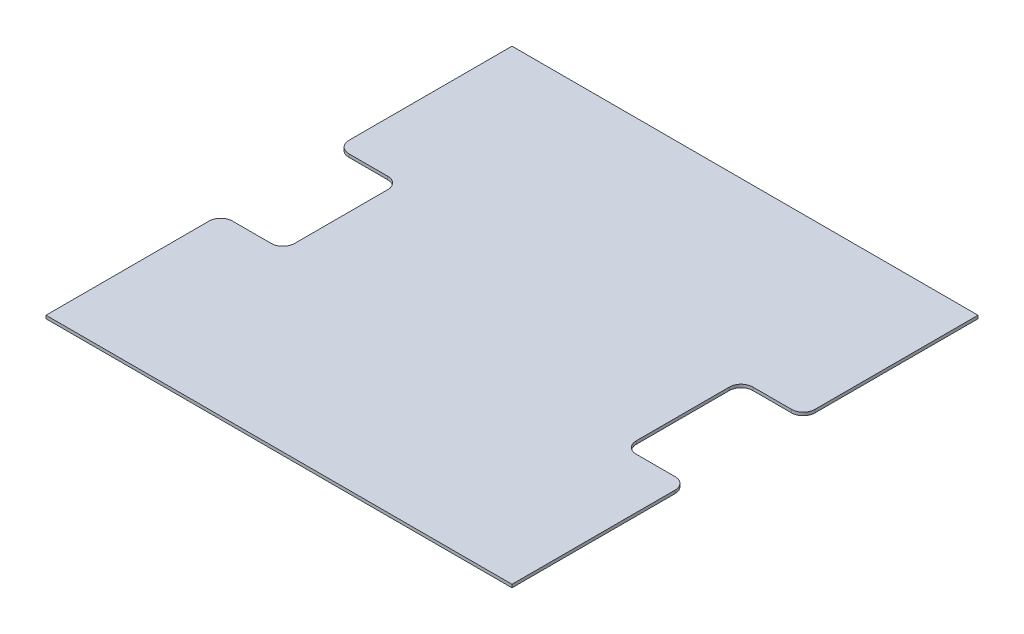
ISO-10303-21;
HEADER;
FILE_DESCRIPTION(('STEP AP214'),'2;1');
FILE_NAME('part.step','',(''),(''),'','','');
FILE_SCHEMA(('AUTOMOTIVE_DESIGN { 1 0 10303 214 1 1 1 1 }'));
ENDSEC;
DATA;
#1=APPLICATION_CONTEXT('core data for automotive mechanical design processes');
#2=APPLICATION_PROTOCOL_DEFINITION('international standard','automotive_design',2000,#1);
#3=PRODUCT_CONTEXT('',#1,'mechanical');
#4=PRODUCT('Part','Part','',(#3));
#5=PRODUCT_RELATED_PRODUCT_CATEGORY('part','',(#4));
#6=PRODUCT_DEFINITION_FORMATION('','',#4);
#7=PRODUCT_DEFINITION_CONTEXT('part definition',#1,'design');
#8=PRODUCT_DEFINITION('design','',#6,#7);
#9=PRODUCT_DEFINITION_SHAPE('','',#8);
#10=(LENGTH_UNIT() NAMED_UNIT(*) SI_UNIT(.MILLI.,.METRE.));
#11=(NAMED_UNIT(*) PLANE_ANGLE_UNIT() SI_UNIT($,.RADIAN.));
#12=(NAMED_UNIT(*) SI_UNIT($,.STERADIAN.) SOLID_ANGLE_UNIT());
#13=UNCERTAINTY_MEASURE_WITH_UNIT(LENGTH_MEASURE(1.E-05),#10,'distance_accuracy_value','');
#14=(GEOMETRIC_REPRESENTATION_CONTEXT(3) GLOBAL_UNCERTAINTY_ASSIGNED_CONTEXT((#13)) GLOBAL_UNIT_ASSIGNED_CONTEXT((#10,
#11,#12)) REPRESENTATION_CONTEXT('',''));
#15=CARTESIAN_POINT('',(0.,0.,0.));
#16=DIRECTION('',(0.,0.,1.));
#17=DIRECTION('',(1.,0.,0.));
#18=AXIS2_PLACEMENT_3D('',#15,#16,#17);
#19=CARTESIAN_POINT('',(-300.,4.,300.));
#20=DIRECTION('',(1.,0.,0.));
#21=DIRECTION('',(0.,0.,-1.));
#22=AXIS2_PLACEMENT_3D('',#19,#20,#21);
#23=PLANE('',#22);
#24=DIRECTION('',(0.,0.,1.));
#25=VECTOR('',#24,1.);
#26=CARTESIAN_POINT('',(-300.,0.,300.));
#27=LINE('',#26,#25);
#28=CARTESIAN_POINT('',(-300.,0.,-300.));
#29=VERTEX_POINT('',#28);
#30=CARTESIAN_POINT('',(-300.,0.,-90.));
#31=VERTEX_POINT('',#30);
#32=EDGE_CURVE('E318',#29,#31,#27,.T.);
#33=ORIENTED_EDGE('',*,*,#32,.T.);
#34=DIRECTION('',(0.,-1.,0.));
#35=VECTOR('',#34,1.);
#36=CARTESIAN_POINT('',(-300.,4.,-90.));
#37=LINE('',#36,#35);
#38=CARTESIAN_POINT('',(-300.,4.,-90.));
#39=VERTEX_POINT('',#38);
#40=EDGE_CURVE('E50',#31,#39,#37,.F.);
#41=ORIENTED_EDGE('',*,*,#40,.T.);
#42=DIRECTION('',(0.,0.,1.));
#43=VECTOR('',#42,1.);
#44=CARTESIAN_POINT('',(-300.,4.,300.));
#45=LINE('',#44,#43);
#46=CARTESIAN_POINT('',(-300.,4.,-300.));
#47=VERTEX_POINT('',#46);
#48=EDGE_CURVE('E307',#47,#39,#45,.T.);
#49=ORIENTED_EDGE('',*,*,#48,.F.);
#50=DIRECTION('',(0.,-1.,0.));
#51=VECTOR('',#50,1.);
#52=CARTESIAN_POINT('',(-300.,4.,-300.));
#53=LINE('',#52,#51);
#54=EDGE_CURVE('E189',#47,#29,#53,.T.);
#55=ORIENTED_EDGE('',*,*,#54,.T.);
#56=EDGE_LOOP('',(#33,#41,#49,#55));
#57=FACE_BOUND('',#56,.T.);
#58=ADVANCED_FACE('F35',(#57),#23,.F.);
#59=CARTESIAN_POINT('',(-300.,4.,90.));
#60=VERTEX_POINT('',#59);
#61=CARTESIAN_POINT('',(-300.,4.,300.));
#62=VERTEX_POINT('',#61);
#63=EDGE_CURVE('E190',#60,#62,#45,.T.);
#64=ORIENTED_EDGE('',*,*,#63,.F.);
#65=DIRECTION('',(0.,-1.,0.));
#66=VECTOR('',#65,1.);
#67=CARTESIAN_POINT('',(-300.,0.,90.));
#68=LINE('',#67,#66);
#69=CARTESIAN_POINT('',(-300.,0.,90.));
#70=VERTEX_POINT('',#69);
#71=EDGE_CURVE('E196',#60,#70,#68,.T.);
#72=ORIENTED_EDGE('',*,*,#71,.T.);
#73=CARTESIAN_POINT('',(-300.,0.,300.));
#74=VERTEX_POINT('',#73);
#75=EDGE_CURVE('E317',#70,#74,#27,.T.);
#76=ORIENTED_EDGE('',*,*,#75,.T.);
#77=DIRECTION('',(0.,-1.,0.));
#78=VECTOR('',#77,1.);
#79=CARTESIAN_POINT('',(-300.,4.,300.));
#80=LINE('',#79,#78);
#81=EDGE_CURVE('E201',#62,#74,#80,.T.);
#82=ORIENTED_EDGE('',*,*,#81,.F.);
#83=EDGE_LOOP('',(#64,#72,#76,#82));
#84=FACE_BOUND('',#83,.T.);
#85=ADVANCED_FACE('F341',(#84),#23,.F.);
#86=CARTESIAN_POINT('',(0.,4.,0.));
#87=DIRECTION('',(0.,-1.,0.));
#88=DIRECTION('',(0.,0.,-1.));
#89=AXIS2_PLACEMENT_3D('',#86,#87,#88);
#90=PLANE('',#89);
#91=DIRECTION('',(-1.,0.,0.));
#92=VECTOR('',#91,1.);
#93=CARTESIAN_POINT('',(-300.,4.,75.));
#94=LINE('',#93,#92);
#95=CARTESIAN_POINT('',(-235.,4.,75.));
#96=VERTEX_POINT('',#95);
#97=CARTESIAN_POINT('',(-285.,4.,75.));
#98=VERTEX_POINT('',#97);
#99=EDGE_CURVE('E282',#96,#98,#94,.T.);
#100=ORIENTED_EDGE('',*,*,#99,.T.);
#101=CARTESIAN_POINT('',(-285.,4.,90.));
#102=DIRECTION('',(0.,-1.,0.));
#103=DIRECTION('',(0.,0.,-1.));
#104=AXIS2_PLACEMENT_3D('',#101,#102,#103);
#105=CIRCLE('',#104,15.);
#106=EDGE_CURVE('E222',#98,#60,#105,.F.);
#107=ORIENTED_EDGE('',*,*,#106,.T.);
#108=ORIENTED_EDGE('',*,*,#63,.T.);
#109=DIRECTION('',(1.,0.,0.));
#110=VECTOR('',#109,1.);
#111=CARTESIAN_POINT('',(-300.,4.,300.));
#112=LINE('',#111,#110);
#113=CARTESIAN_POINT('',(300.,4.,300.));
#114=VERTEX_POINT('',#113);
#115=EDGE_CURVE('E309',#62,#114,#112,.T.);
#116=ORIENTED_EDGE('',*,*,#115,.T.);
#117=DIRECTION('',(0.,0.,-1.));
#118=VECTOR('',#117,1.);
#119=CARTESIAN_POINT('',(300.,4.,300.));
#120=LINE('',#119,#118);
#121=CARTESIAN_POINT('',(300.,4.,90.));
#122=VERTEX_POINT('',#121);
#123=EDGE_CURVE('E181',#114,#122,#120,.T.);
#124=ORIENTED_EDGE('',*,*,#123,.T.);
#125=CARTESIAN_POINT('',(285.,4.,90.));
#126=DIRECTION('',(0.,-1.,0.));
#127=DIRECTION('',(0.,0.,-1.));
#128=AXIS2_PLACEMENT_3D('',#125,#126,#127);
#129=CIRCLE('',#128,15.);
#130=CARTESIAN_POINT('',(285.,4.,75.));
#131=VERTEX_POINT('',#130);
#132=EDGE_CURVE('E217',#122,#131,#129,.F.);
#133=ORIENTED_EDGE('',*,*,#132,.T.);
#134=DIRECTION('',(1.,0.,0.));
#135=VECTOR('',#134,1.);
#136=CARTESIAN_POINT('',(300.,4.,75.));
#137=LINE('',#136,#135);
#138=CARTESIAN_POINT('',(235.,4.,75.));
#139=VERTEX_POINT('',#138);
#140=EDGE_CURVE('E289',#139,#131,#137,.T.);
#141=ORIENTED_EDGE('',*,*,#140,.F.);
#142=CARTESIAN_POINT('',(235.,4.,60.));
#143=DIRECTION('',(0.,-1.,0.));
#144=DIRECTION('',(0.,0.,-1.));
#145=AXIS2_PLACEMENT_3D('',#142,#143,#144);
#146=CIRCLE('',#145,15.);
#147=CARTESIAN_POINT('',(220.,4.,60.));
#148=VERTEX_POINT('',#147);
#149=EDGE_CURVE('E11',#139,#148,#146,.T.);
#150=ORIENTED_EDGE('',*,*,#149,.T.);
#151=DIRECTION('',(0.,0.,1.));
#152=VECTOR('',#151,1.);
#153=CARTESIAN_POINT('',(220.,4.,75.));
#154=LINE('',#153,#152);
#155=CARTESIAN_POINT('',(220.,4.,-60.));
#156=VERTEX_POINT('',#155);
#157=EDGE_CURVE('E287',#156,#148,#154,.T.);
#158=ORIENTED_EDGE('',*,*,#157,.F.);
#159=CARTESIAN_POINT('',(235.,4.,-60.));
#160=DIRECTION('',(0.,-1.,0.));
#161=DIRECTION('',(0.,0.,-1.));
#162=AXIS2_PLACEMENT_3D('',#159,#160,#161);
#163=CIRCLE('',#162,15.);
#164=CARTESIAN_POINT('',(235.,4.,-75.));
#165=VERTEX_POINT('',#164);
#166=EDGE_CURVE('E264',#156,#165,#163,.T.);
#167=ORIENTED_EDGE('',*,*,#166,.T.);
#168=DIRECTION('',(-1.,0.,0.));
#169=VECTOR('',#168,1.);
#170=CARTESIAN_POINT('',(300.,4.,-75.));
#171=LINE('',#170,#169);
#172=CARTESIAN_POINT('',(285.,4.,-75.));
#173=VERTEX_POINT('',#172);
#174=EDGE_CURVE('E293',#173,#165,#171,.T.);
#175=ORIENTED_EDGE('',*,*,#174,.F.);
#176=CARTESIAN_POINT('',(285.,4.,-90.));
#177=DIRECTION('',(0.,-1.,0.));
#178=DIRECTION('',(0.,0.,-1.));
#179=AXIS2_PLACEMENT_3D('',#176,#177,#178);
#180=CIRCLE('',#179,15.);
#181=CARTESIAN_POINT('',(300.,4.,-90.));
#182=VERTEX_POINT('',#181);
#183=EDGE_CURVE('E58',#173,#182,#180,.F.);
#184=ORIENTED_EDGE('',*,*,#183,.T.);
#185=CARTESIAN_POINT('',(300.,4.,-300.));
#186=VERTEX_POINT('',#185);
#187=EDGE_CURVE('E171',#182,#186,#120,.T.);
#188=ORIENTED_EDGE('',*,*,#187,.T.);
#189=DIRECTION('',(-1.,0.,0.));
#190=VECTOR('',#189,1.);
#191=CARTESIAN_POINT('',(-300.,4.,-300.));
#192=LINE('',#191,#190);
#193=EDGE_CURVE('E175',#186,#47,#192,.T.);
#194=ORIENTED_EDGE('',*,*,#193,.T.);
#195=ORIENTED_EDGE('',*,*,#48,.T.);
#196=CARTESIAN_POINT('',(-285.,4.,-90.));
#197=DIRECTION('',(0.,-1.,0.));
#198=DIRECTION('',(0.,0.,-1.));
#199=AXIS2_PLACEMENT_3D('',#196,#197,#198);
#200=CIRCLE('',#199,15.);
#201=CARTESIAN_POINT('',(-285.,4.,-75.));
#202=VERTEX_POINT('',#201);
#203=EDGE_CURVE('E220',#39,#202,#200,.F.);
#204=ORIENTED_EDGE('',*,*,#203,.T.);
#205=DIRECTION('',(1.,0.,0.));
#206=VECTOR('',#205,1.);
#207=CARTESIAN_POINT('',(-300.,4.,-75.));
#208=LINE('',#207,#206);
#209=CARTESIAN_POINT('',(-235.,4.,-75.));
#210=VERTEX_POINT('',#209);
#211=EDGE_CURVE('E301',#202,#210,#208,.T.);
#212=ORIENTED_EDGE('',*,*,#211,.T.);
#213=CARTESIAN_POINT('',(-235.,4.,-60.));
#214=DIRECTION('',(0.,-1.,0.));
#215=DIRECTION('',(0.,0.,-1.));
#216=AXIS2_PLACEMENT_3D('',#213,#214,#215);
#217=CIRCLE('',#216,15.);
#218=CARTESIAN_POINT('',(-220.,4.,-60.));
#219=VERTEX_POINT('',#218);
#220=EDGE_CURVE('E260',#210,#219,#217,.T.);
#221=ORIENTED_EDGE('',*,*,#220,.T.);
#222=DIRECTION('',(0.,0.,1.));
#223=VECTOR('',#222,1.);
#224=CARTESIAN_POINT('',(-220.,4.,75.));
#225=LINE('',#224,#223);
#226=CARTESIAN_POINT('',(-220.,4.,60.));
#227=VERTEX_POINT('',#226);
#228=EDGE_CURVE('E354',#219,#227,#225,.T.);
#229=ORIENTED_EDGE('',*,*,#228,.T.);
#230=CARTESIAN_POINT('',(-235.,4.,60.));
#231=DIRECTION('',(0.,-1.,0.));
#232=DIRECTION('',(0.,0.,-1.));
#233=AXIS2_PLACEMENT_3D('',#230,#231,#232);
#234=CIRCLE('',#233,15.);
#235=EDGE_CURVE('E256',#227,#96,#234,.T.);
#236=ORIENTED_EDGE('',*,*,#235,.T.);
#237=EDGE_LOOP('',(#100,#107,#108,#116,#124,#133,#141,#150,#158,#167,#175,#184,#188,#194,#195,
#204,#212,#221,#229,#236));
#238=FACE_BOUND('',#237,.T.);
#239=ADVANCED_FACE('F174',(#238),#90,.F.);
#240=CARTESIAN_POINT('',(0.,0.,0.));
#241=DIRECTION('',(0.,-1.,0.));
#242=DIRECTION('',(0.,0.,-1.));
#243=AXIS2_PLACEMENT_3D('',#240,#241,#242);
#244=PLANE('',#243);
#245=ORIENTED_EDGE('',*,*,#75,.F.);
#246=CARTESIAN_POINT('',(-285.,0.,90.));
#247=DIRECTION('',(0.,-1.,0.));
#248=DIRECTION('',(0.,0.,-1.));
#249=AXIS2_PLACEMENT_3D('',#246,#247,#248);
#250=CIRCLE('',#249,15.);
#251=CARTESIAN_POINT('',(-285.,0.,75.));
#252=VERTEX_POINT('',#251);
#253=EDGE_CURVE('E210',#70,#252,#250,.T.);
#254=ORIENTED_EDGE('',*,*,#253,.T.);
#255=DIRECTION('',(1.,0.,0.));
#256=VECTOR('',#255,1.);
#257=CARTESIAN_POINT('',(-300.,0.,75.));
#258=LINE('',#257,#256);
#259=CARTESIAN_POINT('',(-235.,0.,75.));
#260=VERTEX_POINT('',#259);
#261=EDGE_CURVE('E347',#252,#260,#258,.T.);
#262=ORIENTED_EDGE('',*,*,#261,.T.);
#263=CARTESIAN_POINT('',(-235.,0.,60.));
#264=DIRECTION('',(0.,-1.,0.));
#265=DIRECTION('',(0.,0.,-1.));
#266=AXIS2_PLACEMENT_3D('',#263,#264,#265);
#267=CIRCLE('',#266,15.);
#268=CARTESIAN_POINT('',(-220.,0.,60.));
#269=VERTEX_POINT('',#268);
#270=EDGE_CURVE('E254',#260,#269,#267,.F.);
#271=ORIENTED_EDGE('',*,*,#270,.T.);
#272=DIRECTION('',(0.,0.,-1.));
#273=VECTOR('',#272,1.);
#274=CARTESIAN_POINT('',(-220.,0.,75.));
#275=LINE('',#274,#273);
#276=CARTESIAN_POINT('',(-220.,0.,-60.));
#277=VERTEX_POINT('',#276);
#278=EDGE_CURVE('E352',#269,#277,#275,.T.);
#279=ORIENTED_EDGE('',*,*,#278,.T.);
#280=CARTESIAN_POINT('',(-235.,0.,-60.));
#281=DIRECTION('',(0.,-1.,0.));
#282=DIRECTION('',(0.,0.,-1.));
#283=AXIS2_PLACEMENT_3D('',#280,#281,#282);
#284=CIRCLE('',#283,15.);
#285=CARTESIAN_POINT('',(-235.,0.,-75.));
#286=VERTEX_POINT('',#285);
#287=EDGE_CURVE('E258',#277,#286,#284,.F.);
#288=ORIENTED_EDGE('',*,*,#287,.T.);
#289=DIRECTION('',(-1.,0.,0.));
#290=VECTOR('',#289,1.);
#291=CARTESIAN_POINT('',(-300.,0.,-75.));
#292=LINE('',#291,#290);
#293=CARTESIAN_POINT('',(-285.,0.,-75.));
#294=VERTEX_POINT('',#293);
#295=EDGE_CURVE('E356',#286,#294,#292,.T.);
#296=ORIENTED_EDGE('',*,*,#295,.T.);
#297=CARTESIAN_POINT('',(-285.,0.,-90.));
#298=DIRECTION('',(0.,-1.,0.));
#299=DIRECTION('',(0.,0.,-1.));
#300=AXIS2_PLACEMENT_3D('',#297,#298,#299);
#301=CIRCLE('',#300,15.);
#302=EDGE_CURVE('E208',#294,#31,#301,.T.);
#303=ORIENTED_EDGE('',*,*,#302,.T.);
#304=ORIENTED_EDGE('',*,*,#32,.F.);
#305=DIRECTION('',(-1.,0.,0.));
#306=VECTOR('',#305,1.);
#307=CARTESIAN_POINT('',(-300.,0.,-300.));
#308=LINE('',#307,#306);
#309=CARTESIAN_POINT('',(300.,0.,-300.));
#310=VERTEX_POINT('',#309);
#311=EDGE_CURVE('E315',#310,#29,#308,.T.);
#312=ORIENTED_EDGE('',*,*,#311,.F.);
#313=DIRECTION('',(0.,0.,-1.));
#314=VECTOR('',#313,1.);
#315=CARTESIAN_POINT('',(300.,0.,300.));
#316=LINE('',#315,#314);
#317=CARTESIAN_POINT('',(300.,0.,-90.));
#318=VERTEX_POINT('',#317);
#319=EDGE_CURVE('E194',#318,#310,#316,.T.);
#320=ORIENTED_EDGE('',*,*,#319,.F.);
#321=CARTESIAN_POINT('',(285.,0.,-90.));
#322=DIRECTION('',(0.,-1.,0.));
#323=DIRECTION('',(0.,0.,-1.));
#324=AXIS2_PLACEMENT_3D('',#321,#322,#323);
#325=CIRCLE('',#324,15.);
#326=CARTESIAN_POINT('',(285.,0.,-75.));
#327=VERTEX_POINT('',#326);
#328=EDGE_CURVE('E206',#318,#327,#325,.T.);
#329=ORIENTED_EDGE('',*,*,#328,.T.);
#330=DIRECTION('',(1.,0.,0.));
#331=VECTOR('',#330,1.);
#332=CARTESIAN_POINT('',(300.,0.,-75.));
#333=LINE('',#332,#331);
#334=CARTESIAN_POINT('',(235.,0.,-75.));
#335=VERTEX_POINT('',#334);
#336=EDGE_CURVE('E294',#335,#327,#333,.T.);
#337=ORIENTED_EDGE('',*,*,#336,.F.);
#338=CARTESIAN_POINT('',(235.,0.,-60.));
#339=DIRECTION('',(0.,-1.,0.));
#340=DIRECTION('',(0.,0.,-1.));
#341=AXIS2_PLACEMENT_3D('',#338,#339,#340);
#342=CIRCLE('',#341,15.);
#343=CARTESIAN_POINT('',(220.,0.,-60.));
#344=VERTEX_POINT('',#343);
#345=EDGE_CURVE('E262',#335,#344,#342,.F.);
#346=ORIENTED_EDGE('',*,*,#345,.T.);
#347=DIRECTION('',(0.,0.,-1.));
#348=VECTOR('',#347,1.);
#349=CARTESIAN_POINT('',(220.,0.,75.));
#350=LINE('',#349,#348);
#351=CARTESIAN_POINT('',(220.,0.,60.));
#352=VERTEX_POINT('',#351);
#353=EDGE_CURVE('E273',#352,#344,#350,.T.);
#354=ORIENTED_EDGE('',*,*,#353,.F.);
#355=CARTESIAN_POINT('',(235.,0.,60.));
#356=DIRECTION('',(0.,-1.,0.));
#357=DIRECTION('',(0.,0.,-1.));
#358=AXIS2_PLACEMENT_3D('',#355,#356,#357);
#359=CIRCLE('',#358,15.);
#360=CARTESIAN_POINT('',(235.,0.,75.));
#361=VERTEX_POINT('',#360);
#362=EDGE_CURVE('E43',#352,#361,#359,.F.);
#363=ORIENTED_EDGE('',*,*,#362,.T.);
#364=DIRECTION('',(-1.,0.,0.));
#365=VECTOR('',#364,1.);
#366=CARTESIAN_POINT('',(300.,0.,75.));
#367=LINE('',#366,#365);
#368=CARTESIAN_POINT('',(285.,0.,75.));
#369=VERTEX_POINT('',#368);
#370=EDGE_CURVE('E271',#369,#361,#367,.T.);
#371=ORIENTED_EDGE('',*,*,#370,.F.);
#372=CARTESIAN_POINT('',(285.,0.,90.));
#373=DIRECTION('',(0.,-1.,0.));
#374=DIRECTION('',(0.,0.,-1.));
#375=AXIS2_PLACEMENT_3D('',#372,#373,#374);
#376=CIRCLE('',#375,15.);
#377=CARTESIAN_POINT('',(300.,0.,90.));
#378=VERTEX_POINT('',#377);
#379=EDGE_CURVE('E199',#369,#378,#376,.T.);
#380=ORIENTED_EDGE('',*,*,#379,.T.);
#381=CARTESIAN_POINT('',(300.,0.,300.));
#382=VERTEX_POINT('',#381);
#383=EDGE_CURVE('E312',#382,#378,#316,.T.);
#384=ORIENTED_EDGE('',*,*,#383,.F.);
#385=DIRECTION('',(1.,0.,0.));
#386=VECTOR('',#385,1.);
#387=CARTESIAN_POINT('',(-300.,0.,300.));
#388=LINE('',#387,#386);
#389=EDGE_CURVE('E182',#74,#382,#388,.T.);
#390=ORIENTED_EDGE('',*,*,#389,.F.);
#391=EDGE_LOOP('',(#245,#254,#262,#271,#279,#288,#296,#303,#304,#312,#320,#329,#337,#346,#354,
#363,#371,#380,#384,#390));
#392=FACE_BOUND('',#391,.T.);
#393=ADVANCED_FACE('F270',(#392),#244,.T.);
#394=CARTESIAN_POINT('',(300.,4.,300.));
#395=DIRECTION('',(-1.,0.,0.));
#396=DIRECTION('',(0.,0.,1.));
#397=AXIS2_PLACEMENT_3D('',#394,#395,#396);
#398=PLANE('',#397);
#399=ORIENTED_EDGE('',*,*,#187,.F.);
#400=DIRECTION('',(0.,-1.,0.));
#401=VECTOR('',#400,1.);
#402=CARTESIAN_POINT('',(300.,4.,-90.));
#403=LINE('',#402,#401);
#404=EDGE_CURVE('E245',#182,#318,#403,.T.);
#405=ORIENTED_EDGE('',*,*,#404,.T.);
#406=ORIENTED_EDGE('',*,*,#319,.T.);
#407=DIRECTION('',(0.,-1.,0.));
#408=VECTOR('',#407,1.);
#409=CARTESIAN_POINT('',(300.,4.,-300.));
#410=LINE('',#409,#408);
#411=EDGE_CURVE('E187',#186,#310,#410,.T.);
#412=ORIENTED_EDGE('',*,*,#411,.F.);
#413=EDGE_LOOP('',(#399,#405,#406,#412));
#414=FACE_BOUND('',#413,.T.);
#415=ADVANCED_FACE('F192',(#414),#398,.F.);
#416=ORIENTED_EDGE('',*,*,#383,.T.);
#417=DIRECTION('',(0.,-1.,0.));
#418=VECTOR('',#417,1.);
#419=CARTESIAN_POINT('',(300.,4.,90.));
#420=LINE('',#419,#418);
#421=EDGE_CURVE('E252',#378,#122,#420,.F.);
#422=ORIENTED_EDGE('',*,*,#421,.T.);
#423=ORIENTED_EDGE('',*,*,#123,.F.);
#424=DIRECTION('',(0.,-1.,0.));
#425=VECTOR('',#424,1.);
#426=CARTESIAN_POINT('',(300.,4.,300.));
#427=LINE('',#426,#425);
#428=EDGE_CURVE('E311',#114,#382,#427,.T.);
#429=ORIENTED_EDGE('',*,*,#428,.T.);
#430=EDGE_LOOP('',(#416,#422,#423,#429));
#431=FACE_BOUND('',#430,.T.);
#432=ADVANCED_FACE('F334',(#431),#398,.F.);
#433=CARTESIAN_POINT('',(-300.,4.,-300.));
#434=DIRECTION('',(0.,0.,1.));
#435=DIRECTION('',(1.,0.,0.));
#436=AXIS2_PLACEMENT_3D('',#433,#434,#435);
#437=PLANE('',#436);
#438=ORIENTED_EDGE('',*,*,#311,.T.);
#439=ORIENTED_EDGE('',*,*,#54,.F.);
#440=ORIENTED_EDGE('',*,*,#193,.F.);
#441=ORIENTED_EDGE('',*,*,#411,.T.);
#442=EDGE_LOOP('',(#438,#439,#440,#441));
#443=FACE_BOUND('',#442,.T.);
#444=ADVANCED_FACE('F186',(#443),#437,.F.);
#445=CARTESIAN_POINT('',(-300.,4.,300.));
#446=DIRECTION('',(0.,0.,-1.));
#447=DIRECTION('',(-1.,0.,0.));
#448=AXIS2_PLACEMENT_3D('',#445,#446,#447);
#449=PLANE('',#448);
#450=ORIENTED_EDGE('',*,*,#389,.T.);
#451=ORIENTED_EDGE('',*,*,#428,.F.);
#452=ORIENTED_EDGE('',*,*,#115,.F.);
#453=ORIENTED_EDGE('',*,*,#81,.T.);
#454=EDGE_LOOP('',(#450,#451,#452,#453));
#455=FACE_BOUND('',#454,.T.);
#456=ADVANCED_FACE('F327',(#455),#449,.F.);
#457=CARTESIAN_POINT('',(300.,174.,-75.));
#458=DIRECTION('',(0.,0.,-1.));
#459=DIRECTION('',(-1.,0.,0.));
#460=AXIS2_PLACEMENT_3D('',#457,#458,#459);
#461=PLANE('',#460);
#462=ORIENTED_EDGE('',*,*,#174,.T.);
#463=DIRECTION('',(0.,-1.,0.));
#464=VECTOR('',#463,1.);
#465=CARTESIAN_POINT('',(235.,0.,-75.));
#466=LINE('',#465,#464);
#467=EDGE_CURVE('E237',#165,#335,#466,.T.);
#468=ORIENTED_EDGE('',*,*,#467,.T.);
#469=ORIENTED_EDGE('',*,*,#336,.T.);
#470=DIRECTION('',(0.,-1.,0.));
#471=VECTOR('',#470,1.);
#472=CARTESIAN_POINT('',(285.,174.,-75.));
#473=LINE('',#472,#471);
#474=EDGE_CURVE('E235',#327,#173,#473,.F.);
#475=ORIENTED_EDGE('',*,*,#474,.T.);
#476=EDGE_LOOP('',(#462,#468,#469,#475));
#477=FACE_BOUND('',#476,.T.);
#478=ADVANCED_FACE('F501',(#477),#461,.F.);
#479=CARTESIAN_POINT('',(220.,174.,75.));
#480=DIRECTION('',(-1.,0.,0.));
#481=DIRECTION('',(0.,0.,1.));
#482=AXIS2_PLACEMENT_3D('',#479,#480,#481);
#483=PLANE('',#482);
#484=ORIENTED_EDGE('',*,*,#353,.T.);
#485=DIRECTION('',(0.,-1.,0.));
#486=VECTOR('',#485,1.);
#487=CARTESIAN_POINT('',(220.,4.,-60.));
#488=LINE('',#487,#486);
#489=EDGE_CURVE('E243',#344,#156,#488,.F.);
#490=ORIENTED_EDGE('',*,*,#489,.T.);
#491=ORIENTED_EDGE('',*,*,#157,.T.);
#492=DIRECTION('',(0.,-1.,0.));
#493=VECTOR('',#492,1.);
#494=CARTESIAN_POINT('',(220.,0.,60.));
#495=LINE('',#494,#493);
#496=EDGE_CURVE('E240',#148,#352,#495,.T.);
#497=ORIENTED_EDGE('',*,*,#496,.T.);
#498=EDGE_LOOP('',(#484,#490,#491,#497));
#499=FACE_BOUND('',#498,.T.);
#500=ADVANCED_FACE('F291',(#499),#483,.F.);
#501=CARTESIAN_POINT('',(300.,174.,75.));
#502=DIRECTION('',(0.,0.,1.));
#503=DIRECTION('',(1.,0.,0.));
#504=AXIS2_PLACEMENT_3D('',#501,#502,#503);
#505=PLANE('',#504);
#506=ORIENTED_EDGE('',*,*,#140,.T.);
#507=DIRECTION('',(0.,-1.,0.));
#508=VECTOR('',#507,1.);
#509=CARTESIAN_POINT('',(285.,174.,75.));
#510=LINE('',#509,#508);
#511=EDGE_CURVE('E249',#131,#369,#510,.T.);
#512=ORIENTED_EDGE('',*,*,#511,.T.);
#513=ORIENTED_EDGE('',*,*,#370,.T.);
#514=DIRECTION('',(0.,-1.,0.));
#515=VECTOR('',#514,1.);
#516=CARTESIAN_POINT('',(235.,4.,75.));
#517=LINE('',#516,#515);
#518=EDGE_CURVE('E247',#361,#139,#517,.F.);
#519=ORIENTED_EDGE('',*,*,#518,.T.);
#520=EDGE_LOOP('',(#506,#512,#513,#519));
#521=FACE_BOUND('',#520,.T.);
#522=ADVANCED_FACE('F279',(#521),#505,.F.);
#523=CARTESIAN_POINT('',(-300.,174.,-75.));
#524=DIRECTION('',(0.,0.,1.));
#525=DIRECTION('',(1.,0.,0.));
#526=AXIS2_PLACEMENT_3D('',#523,#524,#525);
#527=PLANE('',#526);
#528=ORIENTED_EDGE('',*,*,#295,.F.);
#529=DIRECTION('',(0.,-1.,0.));
#530=VECTOR('',#529,1.);
#531=CARTESIAN_POINT('',(-235.,4.,-75.));
#532=LINE('',#531,#530);
#533=EDGE_CURVE('E232',#286,#210,#532,.F.);
#534=ORIENTED_EDGE('',*,*,#533,.T.);
#535=ORIENTED_EDGE('',*,*,#211,.F.);
#536=DIRECTION('',(0.,-1.,0.));
#537=VECTOR('',#536,1.);
#538=CARTESIAN_POINT('',(-285.,0.,-75.));
#539=LINE('',#538,#537);
#540=EDGE_CURVE('E229',#202,#294,#539,.T.);
#541=ORIENTED_EDGE('',*,*,#540,.T.);
#542=EDGE_LOOP('',(#528,#534,#535,#541));
#543=FACE_BOUND('',#542,.T.);
#544=ADVANCED_FACE('F378',(#543),#527,.T.);
#545=CARTESIAN_POINT('',(-220.,174.,75.));
#546=DIRECTION('',(-1.,0.,0.));
#547=DIRECTION('',(0.,0.,1.));
#548=AXIS2_PLACEMENT_3D('',#545,#546,#547);
#549=PLANE('',#548);
#550=ORIENTED_EDGE('',*,*,#278,.F.);
#551=DIRECTION('',(0.,-1.,0.));
#552=VECTOR('',#551,1.);
#553=CARTESIAN_POINT('',(-220.,4.,60.));
#554=LINE('',#553,#552);
#555=EDGE_CURVE('E227',#269,#227,#554,.F.);
#556=ORIENTED_EDGE('',*,*,#555,.T.);
#557=ORIENTED_EDGE('',*,*,#228,.F.);
#558=DIRECTION('',(0.,-1.,0.));
#559=VECTOR('',#558,1.);
#560=CARTESIAN_POINT('',(-220.,0.,-60.));
#561=LINE('',#560,#559);
#562=EDGE_CURVE('E224',#219,#277,#561,.T.);
#563=ORIENTED_EDGE('',*,*,#562,.T.);
#564=EDGE_LOOP('',(#550,#556,#557,#563));
#565=FACE_BOUND('',#564,.T.);
#566=ADVANCED_FACE('F372',(#565),#549,.T.);
#567=CARTESIAN_POINT('',(-300.,174.,75.));
#568=DIRECTION('',(0.,0.,-1.));
#569=DIRECTION('',(-1.,0.,0.));
#570=AXIS2_PLACEMENT_3D('',#567,#568,#569);
#571=PLANE('',#570);
#572=ORIENTED_EDGE('',*,*,#261,.F.);
#573=DIRECTION('',(0.,-1.,0.));
#574=VECTOR('',#573,1.);
#575=CARTESIAN_POINT('',(-285.,4.,75.));
#576=LINE('',#575,#574);
#577=EDGE_CURVE('E215',#252,#98,#576,.F.);
#578=ORIENTED_EDGE('',*,*,#577,.T.);
#579=ORIENTED_EDGE('',*,*,#99,.F.);
#580=DIRECTION('',(0.,-1.,0.));
#581=VECTOR('',#580,1.);
#582=CARTESIAN_POINT('',(-235.,0.,75.));
#583=LINE('',#582,#581);
#584=EDGE_CURVE('E212',#96,#260,#583,.T.);
#585=ORIENTED_EDGE('',*,*,#584,.T.);
#586=EDGE_LOOP('',(#572,#578,#579,#585));
#587=FACE_BOUND('',#586,.T.);
#588=ADVANCED_FACE('F349',(#587),#571,.T.);
#589=CARTESIAN_POINT('',(-285.,4.,90.));
#590=DIRECTION('',(0.,1.,0.));
#591=DIRECTION('',(0.,0.,1.));
#592=AXIS2_PLACEMENT_3D('',#589,#590,#591);
#593=CYLINDRICAL_SURFACE('',#592,15.);
#594=ORIENTED_EDGE('',*,*,#106,.F.);
#595=ORIENTED_EDGE('',*,*,#577,.F.);
#596=ORIENTED_EDGE('',*,*,#253,.F.);
#597=ORIENTED_EDGE('',*,*,#71,.F.);
#598=EDGE_LOOP('',(#594,#595,#596,#597));
#599=FACE_BOUND('',#598,.T.);
#600=ADVANCED_FACE('F343',(#599),#593,.T.);
#601=CARTESIAN_POINT('',(-235.,174.,60.));
#602=DIRECTION('',(0.,1.,0.));
#603=DIRECTION('',(0.,0.,1.));
#604=AXIS2_PLACEMENT_3D('',#601,#602,#603);
#605=CYLINDRICAL_SURFACE('',#604,15.);
#606=ORIENTED_EDGE('',*,*,#235,.F.);
#607=ORIENTED_EDGE('',*,*,#555,.F.);
#608=ORIENTED_EDGE('',*,*,#270,.F.);
#609=ORIENTED_EDGE('',*,*,#584,.F.);
#610=EDGE_LOOP('',(#606,#607,#608,#609));
#611=FACE_BOUND('',#610,.T.);
#612=ADVANCED_FACE('F370',(#611),#605,.F.);
#613=CARTESIAN_POINT('',(-235.,174.,-60.));
#614=DIRECTION('',(0.,1.,0.));
#615=DIRECTION('',(0.,0.,1.));
#616=AXIS2_PLACEMENT_3D('',#613,#614,#615);
#617=CYLINDRICAL_SURFACE('',#616,15.);
#618=ORIENTED_EDGE('',*,*,#220,.F.);
#619=ORIENTED_EDGE('',*,*,#533,.F.);
#620=ORIENTED_EDGE('',*,*,#287,.F.);
#621=ORIENTED_EDGE('',*,*,#562,.F.);
#622=EDGE_LOOP('',(#618,#619,#620,#621));
#623=FACE_BOUND('',#622,.T.);
#624=ADVANCED_FACE('F374',(#623),#617,.F.);
#625=CARTESIAN_POINT('',(-285.,174.,-90.));
#626=DIRECTION('',(0.,1.,0.));
#627=DIRECTION('',(0.,0.,1.));
#628=AXIS2_PLACEMENT_3D('',#625,#626,#627);
#629=CYLINDRICAL_SURFACE('',#628,15.);
#630=ORIENTED_EDGE('',*,*,#203,.F.);
#631=ORIENTED_EDGE('',*,*,#40,.F.);
#632=ORIENTED_EDGE('',*,*,#302,.F.);
#633=ORIENTED_EDGE('',*,*,#540,.F.);
#634=EDGE_LOOP('',(#630,#631,#632,#633));
#635=FACE_BOUND('',#634,.T.);
#636=ADVANCED_FACE('F383',(#635),#629,.T.);
#637=CARTESIAN_POINT('',(235.,174.,-60.));
#638=DIRECTION('',(0.,1.,0.));
#639=DIRECTION('',(0.,0.,1.));
#640=AXIS2_PLACEMENT_3D('',#637,#638,#639);
#641=CYLINDRICAL_SURFACE('',#640,15.);
#642=ORIENTED_EDGE('',*,*,#166,.F.);
#643=ORIENTED_EDGE('',*,*,#489,.F.);
#644=ORIENTED_EDGE('',*,*,#345,.F.);
#645=ORIENTED_EDGE('',*,*,#467,.F.);
#646=EDGE_LOOP('',(#642,#643,#644,#645));
#647=FACE_BOUND('',#646,.T.);
#648=ADVANCED_FACE('F405',(#647),#641,.F.);
#649=CARTESIAN_POINT('',(285.,4.,-90.));
#650=DIRECTION('',(0.,-1.,0.));
#651=DIRECTION('',(0.,0.,-1.));
#652=AXIS2_PLACEMENT_3D('',#649,#650,#651);
#653=CYLINDRICAL_SURFACE('',#652,15.);
#654=ORIENTED_EDGE('',*,*,#183,.F.);
#655=ORIENTED_EDGE('',*,*,#474,.F.);
#656=ORIENTED_EDGE('',*,*,#328,.F.);
#657=ORIENTED_EDGE('',*,*,#404,.F.);
#658=EDGE_LOOP('',(#654,#655,#656,#657));
#659=FACE_BOUND('',#658,.T.);
#660=ADVANCED_FACE('F408',(#659),#653,.T.);
#661=CARTESIAN_POINT('',(285.,174.,90.));
#662=DIRECTION('',(0.,-1.,0.));
#663=DIRECTION('',(0.,0.,-1.));
#664=AXIS2_PLACEMENT_3D('',#661,#662,#663);
#665=CYLINDRICAL_SURFACE('',#664,15.);
#666=ORIENTED_EDGE('',*,*,#132,.F.);
#667=ORIENTED_EDGE('',*,*,#421,.F.);
#668=ORIENTED_EDGE('',*,*,#379,.F.);
#669=ORIENTED_EDGE('',*,*,#511,.F.);
#670=EDGE_LOOP('',(#666,#667,#668,#669));
#671=FACE_BOUND('',#670,.T.);
#672=ADVANCED_FACE('F338',(#671),#665,.T.);
#673=CARTESIAN_POINT('',(235.,174.,60.));
#674=DIRECTION('',(0.,1.,0.));
#675=DIRECTION('',(0.,0.,1.));
#676=AXIS2_PLACEMENT_3D('',#673,#674,#675);
#677=CYLINDRICAL_SURFACE('',#676,15.);
#678=ORIENTED_EDGE('',*,*,#149,.F.);
#679=ORIENTED_EDGE('',*,*,#518,.F.);
#680=ORIENTED_EDGE('',*,*,#362,.F.);
#681=ORIENTED_EDGE('',*,*,#496,.F.);
#682=EDGE_LOOP('',(#678,#679,#680,#681));
#683=FACE_BOUND('',#682,.T.);
#684=ADVANCED_FACE('F37',(#683),#677,.F.);
#685=CLOSED_SHELL('',(#58,#85,#239,#393,#415,#432,#444,#456,#478,#500,#522,#544,#566,#588,#600,
#612,#624,#636,#648,#660,#672,#684));
#686=MANIFOLD_SOLID_BREP('B2',#685);
#687=ADVANCED_BREP_SHAPE_REPRESENTATION('',(#18,#686),#14);
#688=SHAPE_DEFINITION_REPRESENTATION(#9,#687);
ENDSEC;
END-ISO-10303-21;
